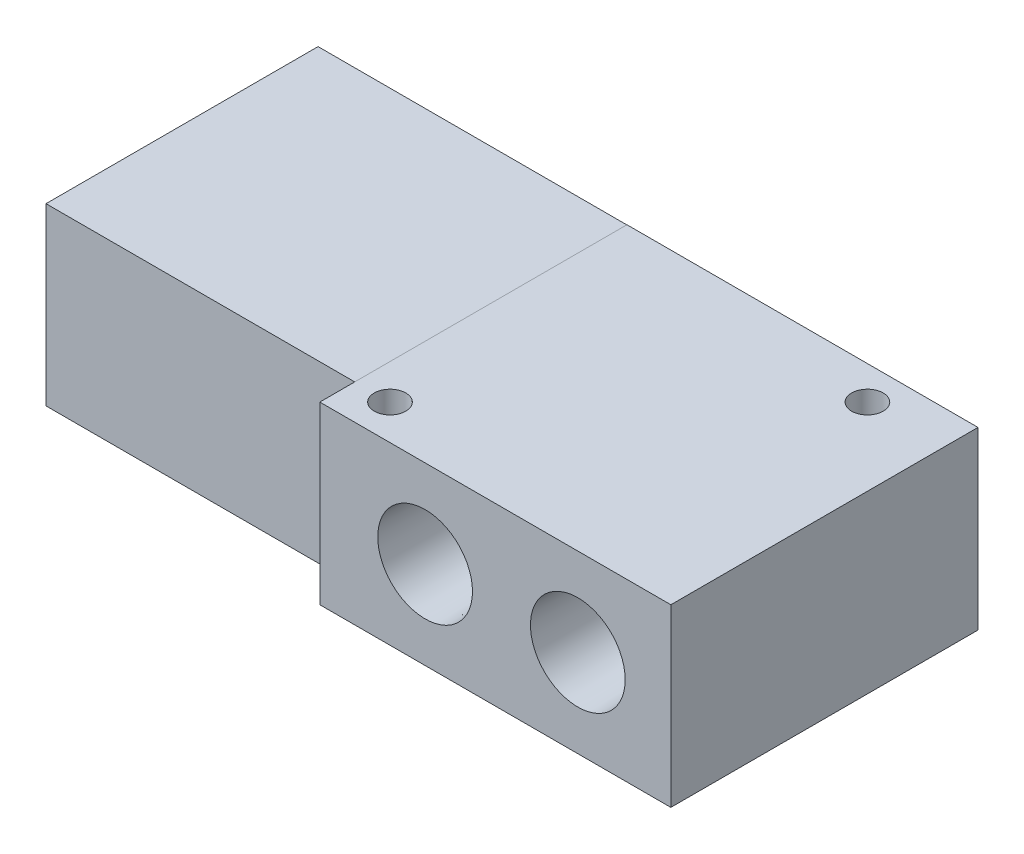
ISO-10303-21;
HEADER;
FILE_DESCRIPTION(('STEP AP214'),'2;1');
FILE_NAME('part.step','',(''),(''),'','','');
FILE_SCHEMA(('AUTOMOTIVE_DESIGN { 1 0 10303 214 1 1 1 1 }'));
ENDSEC;
DATA;
#1=APPLICATION_CONTEXT('core data for automotive mechanical design processes');
#2=APPLICATION_PROTOCOL_DEFINITION('international standard','automotive_design',2000,#1);
#3=PRODUCT_CONTEXT('',#1,'mechanical');
#4=PRODUCT('Part','Part','',(#3));
#5=PRODUCT_RELATED_PRODUCT_CATEGORY('part','',(#4));
#6=PRODUCT_DEFINITION_FORMATION('','',#4);
#7=PRODUCT_DEFINITION_CONTEXT('part definition',#1,'design');
#8=PRODUCT_DEFINITION('design','',#6,#7);
#9=PRODUCT_DEFINITION_SHAPE('','',#8);
#10=(LENGTH_UNIT() NAMED_UNIT(*) SI_UNIT(.MILLI.,.METRE.));
#11=(NAMED_UNIT(*) PLANE_ANGLE_UNIT() SI_UNIT($,.RADIAN.));
#12=(NAMED_UNIT(*) SI_UNIT($,.STERADIAN.) SOLID_ANGLE_UNIT());
#13=UNCERTAINTY_MEASURE_WITH_UNIT(LENGTH_MEASURE(1.E-05),#10,'distance_accuracy_value','');
#14=(GEOMETRIC_REPRESENTATION_CONTEXT(3) GLOBAL_UNCERTAINTY_ASSIGNED_CONTEXT((#13)) GLOBAL_UNIT_ASSIGNED_CONTEXT((#10,
#11,#12)) REPRESENTATION_CONTEXT('',''));
#15=CARTESIAN_POINT('',(0.,0.,0.));
#16=DIRECTION('',(0.,0.,1.));
#17=DIRECTION('',(1.,0.,0.));
#18=AXIS2_PLACEMENT_3D('',#15,#16,#17);
#19=CARTESIAN_POINT('',(95.504,25.4,5.08));
#20=DIRECTION('',(-1.,0.,0.));
#21=DIRECTION('',(0.,0.,1.));
#22=AXIS2_PLACEMENT_3D('',#19,#20,#21);
#23=PLANE('',#22);
#24=DIRECTION('',(0.,0.,-1.));
#25=VECTOR('',#24,1.);
#26=CARTESIAN_POINT('',(95.504,0.,5.08));
#27=LINE('',#26,#25);
#28=CARTESIAN_POINT('',(95.504,0.,5.08));
#29=VERTEX_POINT('',#28);
#30=CARTESIAN_POINT('',(95.504,0.,-39.37));
#31=VERTEX_POINT('',#30);
#32=EDGE_CURVE('E190',#29,#31,#27,.T.);
#33=ORIENTED_EDGE('',*,*,#32,.T.);
#34=DIRECTION('',(0.,-1.,0.));
#35=VECTOR('',#34,1.);
#36=CARTESIAN_POINT('',(95.504,25.4,-39.37));
#37=LINE('',#36,#35);
#38=CARTESIAN_POINT('',(95.504,25.4,-39.37));
#39=VERTEX_POINT('',#38);
#40=EDGE_CURVE('E11',#39,#31,#37,.T.);
#41=ORIENTED_EDGE('',*,*,#40,.F.);
#42=DIRECTION('',(0.,0.,-1.));
#43=VECTOR('',#42,1.);
#44=CARTESIAN_POINT('',(95.504,25.4,5.08));
#45=LINE('',#44,#43);
#46=CARTESIAN_POINT('',(95.504,25.4,5.08));
#47=VERTEX_POINT('',#46);
#48=EDGE_CURVE('E192',#47,#39,#45,.T.);
#49=ORIENTED_EDGE('',*,*,#48,.F.);
#50=DIRECTION('',(0.,-1.,0.));
#51=VECTOR('',#50,1.);
#52=CARTESIAN_POINT('',(95.504,25.4,5.08));
#53=LINE('',#52,#51);
#54=EDGE_CURVE('E198',#47,#29,#53,.T.);
#55=ORIENTED_EDGE('',*,*,#54,.T.);
#56=EDGE_LOOP('',(#33,#41,#49,#55));
#57=FACE_BOUND('',#56,.T.);
#58=ADVANCED_FACE('F33',(#57),#23,.F.);
#59=CARTESIAN_POINT('',(0.,25.4,-39.37));
#60=DIRECTION('',(0.,0.,1.));
#61=DIRECTION('',(1.,0.,0.));
#62=AXIS2_PLACEMENT_3D('',#59,#60,#61);
#63=PLANE('',#62);
#64=CARTESIAN_POINT('',(69.85,12.7,-39.37));
#65=DIRECTION('',(0.,0.,-1.));
#66=DIRECTION('',(-1.,0.,0.));
#67=AXIS2_PLACEMENT_3D('',#64,#65,#66);
#68=CIRCLE('',#67,6.8545837);
#69=CARTESIAN_POINT('',(62.9954163,12.7,-39.37));
#70=VERTEX_POINT('',#69);
#71=EDGE_CURVE('E142',#70,#70,#68,.T.);
#72=ORIENTED_EDGE('',*,*,#71,.F.);
#73=EDGE_LOOP('',(#72));
#74=FACE_BOUND('',#73,.T.);
#75=DIRECTION('',(0.,1.,0.));
#76=VECTOR('',#75,1.);
#77=CARTESIAN_POINT('',(44.704,0.,-39.37));
#78=LINE('',#77,#76);
#79=CARTESIAN_POINT('',(44.704,0.,-39.37));
#80=VERTEX_POINT('',#79);
#81=CARTESIAN_POINT('',(44.704,0.0254000000000018,-39.37));
#82=VERTEX_POINT('',#81);
#83=EDGE_CURVE('E167',#80,#82,#78,.T.);
#84=ORIENTED_EDGE('',*,*,#83,.T.);
#85=DIRECTION('',(-1.,0.,0.));
#86=VECTOR('',#85,1.);
#87=CARTESIAN_POINT('',(0.,0.0254000000000001,-39.37));
#88=LINE('',#87,#86);
#89=CARTESIAN_POINT('',(0.,0.0254000000000001,-39.37));
#90=VERTEX_POINT('',#89);
#91=EDGE_CURVE('E170',#82,#90,#88,.T.);
#92=ORIENTED_EDGE('',*,*,#91,.T.);
#93=DIRECTION('',(0.,-1.,0.));
#94=VECTOR('',#93,1.);
#95=CARTESIAN_POINT('',(0.,25.4,-39.37));
#96=LINE('',#95,#94);
#97=CARTESIAN_POINT('',(0.,25.3746,-39.37));
#98=VERTEX_POINT('',#97);
#99=EDGE_CURVE('E40',#98,#90,#96,.T.);
#100=ORIENTED_EDGE('',*,*,#99,.F.);
#101=DIRECTION('',(1.,0.,0.));
#102=VECTOR('',#101,1.);
#103=CARTESIAN_POINT('',(0.,25.3746,-39.37));
#104=LINE('',#103,#102);
#105=CARTESIAN_POINT('',(44.704,25.3746,-39.37));
#106=VERTEX_POINT('',#105);
#107=EDGE_CURVE('E180',#98,#106,#104,.T.);
#108=ORIENTED_EDGE('',*,*,#107,.T.);
#109=DIRECTION('',(0.,1.,0.));
#110=VECTOR('',#109,1.);
#111=CARTESIAN_POINT('',(44.704,25.4,-39.37));
#112=LINE('',#111,#110);
#113=CARTESIAN_POINT('',(44.704,25.4,-39.37));
#114=VERTEX_POINT('',#113);
#115=EDGE_CURVE('E183',#106,#114,#112,.T.);
#116=ORIENTED_EDGE('',*,*,#115,.T.);
#117=DIRECTION('',(-1.,0.,0.));
#118=VECTOR('',#117,1.);
#119=CARTESIAN_POINT('',(0.,25.4,-39.37));
#120=LINE('',#119,#118);
#121=EDGE_CURVE('E76',#39,#114,#120,.T.);
#122=ORIENTED_EDGE('',*,*,#121,.F.);
#123=ORIENTED_EDGE('',*,*,#40,.T.);
#124=DIRECTION('',(-1.,0.,0.));
#125=VECTOR('',#124,1.);
#126=CARTESIAN_POINT('',(0.,0.,-39.37));
#127=LINE('',#126,#125);
#128=EDGE_CURVE('E201',#31,#80,#127,.T.);
#129=ORIENTED_EDGE('',*,*,#128,.T.);
#130=EDGE_LOOP('',(#84,#92,#100,#108,#116,#122,#123,#129));
#131=FACE_BOUND('',#130,.T.);
#132=ADVANCED_FACE('F220',(#74,#131),#63,.F.);
#133=CARTESIAN_POINT('',(0.,25.4,0.));
#134=DIRECTION('',(1.,0.,0.));
#135=DIRECTION('',(0.,0.,-1.));
#136=AXIS2_PLACEMENT_3D('',#133,#134,#135);
#137=PLANE('',#136);
#138=ORIENTED_EDGE('',*,*,#99,.T.);
#139=DIRECTION('',(0.,0.,1.));
#140=VECTOR('',#139,1.);
#141=CARTESIAN_POINT('',(0.,0.0254000000000001,-39.37));
#142=LINE('',#141,#140);
#143=CARTESIAN_POINT('',(0.,0.0254000000000001,0.));
#144=VERTEX_POINT('',#143);
#145=EDGE_CURVE('E175',#90,#144,#142,.T.);
#146=ORIENTED_EDGE('',*,*,#145,.T.);
#147=DIRECTION('',(0.,-1.,0.));
#148=VECTOR('',#147,1.);
#149=CARTESIAN_POINT('',(0.,25.4,0.));
#150=LINE('',#149,#148);
#151=CARTESIAN_POINT('',(0.,25.3746,0.));
#152=VERTEX_POINT('',#151);
#153=EDGE_CURVE('E212',#152,#144,#150,.T.);
#154=ORIENTED_EDGE('',*,*,#153,.F.);
#155=DIRECTION('',(0.,0.,1.));
#156=VECTOR('',#155,1.);
#157=CARTESIAN_POINT('',(0.,25.3746,-39.37));
#158=LINE('',#157,#156);
#159=EDGE_CURVE('E185',#98,#152,#158,.T.);
#160=ORIENTED_EDGE('',*,*,#159,.F.);
#161=EDGE_LOOP('',(#138,#146,#154,#160));
#162=FACE_BOUND('',#161,.T.);
#163=ADVANCED_FACE('F218',(#162),#137,.F.);
#164=CARTESIAN_POINT('',(0.,25.4,0.));
#165=DIRECTION('',(0.,0.,-1.));
#166=DIRECTION('',(-1.,0.,0.));
#167=AXIS2_PLACEMENT_3D('',#164,#165,#166);
#168=PLANE('',#167);
#169=ORIENTED_EDGE('',*,*,#153,.T.);
#170=DIRECTION('',(-1.,0.,0.));
#171=VECTOR('',#170,1.);
#172=CARTESIAN_POINT('',(0.,0.0254000000000001,0.));
#173=LINE('',#172,#171);
#174=CARTESIAN_POINT('',(44.704,0.0254000000000018,0.));
#175=VERTEX_POINT('',#174);
#176=EDGE_CURVE('E164',#175,#144,#173,.T.);
#177=ORIENTED_EDGE('',*,*,#176,.F.);
#178=DIRECTION('',(0.,-1.,0.));
#179=VECTOR('',#178,1.);
#180=CARTESIAN_POINT('',(44.704,25.4,0.));
#181=LINE('',#180,#179);
#182=CARTESIAN_POINT('',(44.704,25.3746,0.));
#183=VERTEX_POINT('',#182);
#184=EDGE_CURVE('E209',#183,#175,#181,.T.);
#185=ORIENTED_EDGE('',*,*,#184,.F.);
#186=DIRECTION('',(1.,0.,0.));
#187=VECTOR('',#186,1.);
#188=CARTESIAN_POINT('',(0.,25.3746,0.));
#189=LINE('',#188,#187);
#190=EDGE_CURVE('E178',#152,#183,#189,.T.);
#191=ORIENTED_EDGE('',*,*,#190,.F.);
#192=EDGE_LOOP('',(#169,#177,#185,#191));
#193=FACE_BOUND('',#192,.T.);
#194=ADVANCED_FACE('F227',(#193),#168,.F.);
#195=CARTESIAN_POINT('',(44.704,25.4,5.08));
#196=DIRECTION('',(1.,0.,0.));
#197=DIRECTION('',(0.,0.,-1.));
#198=AXIS2_PLACEMENT_3D('',#195,#196,#197);
#199=PLANE('',#198);
#200=DIRECTION('',(0.,0.,1.));
#201=VECTOR('',#200,1.);
#202=CARTESIAN_POINT('',(44.704,0.,5.08));
#203=LINE('',#202,#201);
#204=CARTESIAN_POINT('',(44.704,0.,5.08));
#205=VERTEX_POINT('',#204);
#206=EDGE_CURVE('E47',#80,#205,#203,.T.);
#207=ORIENTED_EDGE('',*,*,#206,.T.);
#208=DIRECTION('',(0.,-1.,0.));
#209=VECTOR('',#208,1.);
#210=CARTESIAN_POINT('',(44.704,25.4,5.08));
#211=LINE('',#210,#209);
#212=CARTESIAN_POINT('',(44.704,25.4,5.08));
#213=VERTEX_POINT('',#212);
#214=EDGE_CURVE('E207',#213,#205,#211,.T.);
#215=ORIENTED_EDGE('',*,*,#214,.F.);
#216=DIRECTION('',(0.,0.,1.));
#217=VECTOR('',#216,1.);
#218=CARTESIAN_POINT('',(44.704,25.4,5.08));
#219=LINE('',#218,#217);
#220=EDGE_CURVE('E195',#114,#213,#219,.T.);
#221=ORIENTED_EDGE('',*,*,#220,.F.);
#222=ORIENTED_EDGE('',*,*,#115,.F.);
#223=DIRECTION('',(0.,0.,1.));
#224=VECTOR('',#223,1.);
#225=CARTESIAN_POINT('',(44.704,25.3746,-39.37));
#226=LINE('',#225,#224);
#227=EDGE_CURVE('E188',#106,#183,#226,.T.);
#228=ORIENTED_EDGE('',*,*,#227,.T.);
#229=ORIENTED_EDGE('',*,*,#184,.T.);
#230=DIRECTION('',(0.,0.,1.));
#231=VECTOR('',#230,1.);
#232=CARTESIAN_POINT('',(44.704,0.0254000000000018,-39.37));
#233=LINE('',#232,#231);
#234=EDGE_CURVE('E173',#82,#175,#233,.T.);
#235=ORIENTED_EDGE('',*,*,#234,.F.);
#236=ORIENTED_EDGE('',*,*,#83,.F.);
#237=EDGE_LOOP('',(#207,#215,#221,#222,#228,#229,#235,#236));
#238=FACE_BOUND('',#237,.T.);
#239=ADVANCED_FACE('F230',(#238),#199,.F.);
#240=CARTESIAN_POINT('',(44.704,25.4,5.08));
#241=DIRECTION('',(0.,0.,-1.));
#242=DIRECTION('',(-1.,0.,0.));
#243=AXIS2_PLACEMENT_3D('',#240,#241,#242);
#244=PLANE('',#243);
#245=CARTESIAN_POINT('',(59.944,12.7,5.08000000000001));
#246=DIRECTION('',(0.,0.,1.));
#247=DIRECTION('',(1.,0.,0.));
#248=AXIS2_PLACEMENT_3D('',#245,#246,#247);
#249=CIRCLE('',#248,6.8545837);
#250=CARTESIAN_POINT('',(66.7985837,12.7,5.08000000000001));
#251=VERTEX_POINT('',#250);
#252=EDGE_CURVE('E476',#251,#251,#249,.T.);
#253=ORIENTED_EDGE('',*,*,#252,.F.);
#254=EDGE_LOOP('',(#253));
#255=FACE_BOUND('',#254,.T.);
#256=CARTESIAN_POINT('',(82.042,12.7,5.08000000000001));
#257=DIRECTION('',(0.,0.,1.));
#258=DIRECTION('',(1.,0.,0.));
#259=AXIS2_PLACEMENT_3D('',#256,#257,#258);
#260=CIRCLE('',#259,6.8545837);
#261=CARTESIAN_POINT('',(88.8965837,12.7,5.08000000000001));
#262=VERTEX_POINT('',#261);
#263=EDGE_CURVE('E123',#262,#262,#260,.T.);
#264=ORIENTED_EDGE('',*,*,#263,.F.);
#265=EDGE_LOOP('',(#264));
#266=FACE_BOUND('',#265,.T.);
#267=DIRECTION('',(1.,0.,0.));
#268=VECTOR('',#267,1.);
#269=CARTESIAN_POINT('',(44.704,0.,5.08));
#270=LINE('',#269,#268);
#271=EDGE_CURVE('E70',#205,#29,#270,.T.);
#272=ORIENTED_EDGE('',*,*,#271,.T.);
#273=ORIENTED_EDGE('',*,*,#54,.F.);
#274=DIRECTION('',(1.,0.,0.));
#275=VECTOR('',#274,1.);
#276=CARTESIAN_POINT('',(44.704,25.4,5.08));
#277=LINE('',#276,#275);
#278=EDGE_CURVE('E56',#213,#47,#277,.T.);
#279=ORIENTED_EDGE('',*,*,#278,.F.);
#280=ORIENTED_EDGE('',*,*,#214,.T.);
#281=EDGE_LOOP('',(#272,#273,#279,#280));
#282=FACE_BOUND('',#281,.T.);
#283=ADVANCED_FACE('F256',(#255,#266,#282),#244,.F.);
#284=CARTESIAN_POINT('',(0.,25.4,0.));
#285=DIRECTION('',(0.,-1.,0.));
#286=DIRECTION('',(0.,0.,-1.));
#287=AXIS2_PLACEMENT_3D('',#284,#285,#286);
#288=PLANE('',#287);
#289=CARTESIAN_POINT('',(84.328,25.4,-34.544));
#290=DIRECTION('',(0.,1.,0.));
#291=DIRECTION('',(0.,0.,1.));
#292=AXIS2_PLACEMENT_3D('',#289,#290,#291);
#293=CIRCLE('',#292,2.28599999999999);
#294=CARTESIAN_POINT('',(84.328,25.4,-32.258));
#295=VERTEX_POINT('',#294);
#296=EDGE_CURVE('E154',#295,#295,#293,.T.);
#297=ORIENTED_EDGE('',*,*,#296,.F.);
#298=EDGE_LOOP('',(#297));
#299=FACE_BOUND('',#298,.T.);
#300=CARTESIAN_POINT('',(49.784,25.4,0.));
#301=DIRECTION('',(0.,1.,0.));
#302=DIRECTION('',(0.,0.,1.));
#303=AXIS2_PLACEMENT_3D('',#300,#301,#302);
#304=CIRCLE('',#303,2.28599999999999);
#305=CARTESIAN_POINT('',(49.784,25.4,2.286));
#306=VERTEX_POINT('',#305);
#307=EDGE_CURVE('E158',#306,#306,#304,.T.);
#308=ORIENTED_EDGE('',*,*,#307,.F.);
#309=EDGE_LOOP('',(#308));
#310=FACE_BOUND('',#309,.T.);
#311=ORIENTED_EDGE('',*,*,#121,.T.);
#312=ORIENTED_EDGE('',*,*,#220,.T.);
#313=ORIENTED_EDGE('',*,*,#278,.T.);
#314=ORIENTED_EDGE('',*,*,#48,.T.);
#315=EDGE_LOOP('',(#311,#312,#313,#314));
#316=FACE_BOUND('',#315,.T.);
#317=ADVANCED_FACE('F243',(#299,#310,#316),#288,.F.);
#318=CARTESIAN_POINT('',(0.,0.,0.));
#319=DIRECTION('',(0.,-1.,0.));
#320=DIRECTION('',(0.,0.,-1.));
#321=AXIS2_PLACEMENT_3D('',#318,#319,#320);
#322=PLANE('',#321);
#323=CARTESIAN_POINT('',(84.328,0.,-34.544));
#324=DIRECTION('',(0.,1.,0.));
#325=DIRECTION('',(0.,0.,1.));
#326=AXIS2_PLACEMENT_3D('',#323,#324,#325);
#327=CIRCLE('',#326,2.28599999999999);
#328=CARTESIAN_POINT('',(84.328,0.,-32.258));
#329=VERTEX_POINT('',#328);
#330=EDGE_CURVE('E155',#329,#329,#327,.T.);
#331=ORIENTED_EDGE('',*,*,#330,.T.);
#332=EDGE_LOOP('',(#331));
#333=FACE_BOUND('',#332,.T.);
#334=CARTESIAN_POINT('',(49.784,0.,0.));
#335=DIRECTION('',(0.,1.,0.));
#336=DIRECTION('',(0.,0.,1.));
#337=AXIS2_PLACEMENT_3D('',#334,#335,#336);
#338=CIRCLE('',#337,2.28599999999999);
#339=CARTESIAN_POINT('',(49.784,0.,2.286));
#340=VERTEX_POINT('',#339);
#341=EDGE_CURVE('E161',#340,#340,#338,.T.);
#342=ORIENTED_EDGE('',*,*,#341,.T.);
#343=EDGE_LOOP('',(#342));
#344=FACE_BOUND('',#343,.T.);
#345=ORIENTED_EDGE('',*,*,#206,.F.);
#346=ORIENTED_EDGE('',*,*,#128,.F.);
#347=ORIENTED_EDGE('',*,*,#32,.F.);
#348=ORIENTED_EDGE('',*,*,#271,.F.);
#349=EDGE_LOOP('',(#345,#346,#347,#348));
#350=FACE_BOUND('',#349,.T.);
#351=ADVANCED_FACE('F235',(#333,#344,#350),#322,.T.);
#352=CARTESIAN_POINT('',(0.,25.3746,-39.37));
#353=DIRECTION('',(0.,-1.,0.));
#354=DIRECTION('',(0.,0.,-1.));
#355=AXIS2_PLACEMENT_3D('',#352,#353,#354);
#356=PLANE('',#355);
#357=ORIENTED_EDGE('',*,*,#190,.T.);
#358=ORIENTED_EDGE('',*,*,#227,.F.);
#359=ORIENTED_EDGE('',*,*,#107,.F.);
#360=ORIENTED_EDGE('',*,*,#159,.T.);
#361=EDGE_LOOP('',(#357,#358,#359,#360));
#362=FACE_BOUND('',#361,.T.);
#363=ADVANCED_FACE('F233',(#362),#356,.F.);
#364=CARTESIAN_POINT('',(0.,0.0254000000000001,-39.37));
#365=DIRECTION('',(0.,1.,0.));
#366=DIRECTION('',(-1.,0.,0.));
#367=AXIS2_PLACEMENT_3D('',#364,#365,#366);
#368=PLANE('',#367);
#369=ORIENTED_EDGE('',*,*,#176,.T.);
#370=ORIENTED_EDGE('',*,*,#145,.F.);
#371=ORIENTED_EDGE('',*,*,#91,.F.);
#372=ORIENTED_EDGE('',*,*,#234,.T.);
#373=EDGE_LOOP('',(#369,#370,#371,#372));
#374=FACE_BOUND('',#373,.T.);
#375=ADVANCED_FACE('F223',(#374),#368,.F.);
#376=CARTESIAN_POINT('',(49.784,0.,0.));
#377=DIRECTION('',(0.,1.,0.));
#378=DIRECTION('',(0.,0.,1.));
#379=AXIS2_PLACEMENT_3D('',#376,#377,#378);
#380=CYLINDRICAL_SURFACE('',#379,2.28599999999999);
#381=ORIENTED_EDGE('',*,*,#341,.F.);
#382=EDGE_LOOP('',(#381));
#383=FACE_BOUND('',#382,.T.);
#384=ORIENTED_EDGE('',*,*,#307,.T.);
#385=EDGE_LOOP('',(#384));
#386=FACE_BOUND('',#385,.T.);
#387=ADVANCED_FACE('F241',(#383,#386),#380,.F.);
#388=CARTESIAN_POINT('',(84.328,0.,-34.544));
#389=DIRECTION('',(0.,1.,0.));
#390=DIRECTION('',(0.,0.,1.));
#391=AXIS2_PLACEMENT_3D('',#388,#389,#390);
#392=CYLINDRICAL_SURFACE('',#391,2.28599999999999);
#393=ORIENTED_EDGE('',*,*,#330,.F.);
#394=EDGE_LOOP('',(#393));
#395=FACE_BOUND('',#394,.T.);
#396=ORIENTED_EDGE('',*,*,#296,.T.);
#397=EDGE_LOOP('',(#396));
#398=FACE_BOUND('',#397,.T.);
#399=ADVANCED_FACE('F305',(#395,#398),#392,.F.);
#400=CARTESIAN_POINT('',(69.85,12.7,-22.352));
#401=DIRECTION('',(0.,0.,-1.));
#402=DIRECTION('',(-1.,0.,0.));
#403=AXIS2_PLACEMENT_3D('',#400,#401,#402);
#404=CONICAL_SURFACE('',#403,5.56260000000001,1.02974425867665);
#405=CARTESIAN_POINT('',(69.85,12.7,-19.0096527205973));
#406=VERTEX_POINT('',#405);
#407=VERTEX_LOOP('',#406);
#408=FACE_BOUND('',#407,.T.);
#409=CARTESIAN_POINT('',(69.85,12.7,-22.352));
#410=DIRECTION('',(0.,0.,-1.));
#411=DIRECTION('',(-1.,0.,0.));
#412=AXIS2_PLACEMENT_3D('',#409,#410,#411);
#413=CIRCLE('',#412,5.56260000000001);
#414=CARTESIAN_POINT('',(64.2874,12.7,-22.352));
#415=VERTEX_POINT('',#414);
#416=EDGE_CURVE('E151',#415,#415,#413,.T.);
#417=ORIENTED_EDGE('',*,*,#416,.T.);
#418=EDGE_LOOP('',(#417));
#419=FACE_BOUND('',#418,.T.);
#420=ADVANCED_FACE('F299',(#408,#419),#404,.F.);
#421=CARTESIAN_POINT('',(69.85,12.7,-39.37));
#422=DIRECTION('',(0.,0.,-1.));
#423=DIRECTION('',(-1.,0.,0.));
#424=AXIS2_PLACEMENT_3D('',#421,#422,#423);
#425=CYLINDRICAL_SURFACE('',#424,5.56260000000001);
#426=ORIENTED_EDGE('',*,*,#416,.F.);
#427=EDGE_LOOP('',(#426));
#428=FACE_BOUND('',#427,.T.);
#429=CARTESIAN_POINT('',(69.85,12.7,-29.464));
#430=DIRECTION('',(0.,0.,-1.));
#431=DIRECTION('',(-1.,0.,0.));
#432=AXIS2_PLACEMENT_3D('',#429,#430,#431);
#433=CIRCLE('',#432,5.5626);
#434=CARTESIAN_POINT('',(64.2874,12.7,-29.464));
#435=VERTEX_POINT('',#434);
#436=EDGE_CURVE('E148',#435,#435,#433,.T.);
#437=ORIENTED_EDGE('',*,*,#436,.T.);
#438=EDGE_LOOP('',(#437));
#439=FACE_BOUND('',#438,.T.);
#440=ADVANCED_FACE('F304',(#428,#439),#425,.F.);
#441=CARTESIAN_POINT('',(75.4126,12.7,-29.464));
#442=DIRECTION('',(0.,0.,1.));
#443=DIRECTION('',(1.,0.,0.));
#444=AXIS2_PLACEMENT_3D('',#441,#442,#443);
#445=PLANE('',#444);
#446=ORIENTED_EDGE('',*,*,#436,.F.);
#447=EDGE_LOOP('',(#446));
#448=FACE_BOUND('',#447,.T.);
#449=CARTESIAN_POINT('',(69.85,12.7,-29.464));
#450=DIRECTION('',(0.,0.,-1.));
#451=DIRECTION('',(-1.,0.,0.));
#452=AXIS2_PLACEMENT_3D('',#449,#450,#451);
#453=CIRCLE('',#452,6.55798479417671);
#454=CARTESIAN_POINT('',(63.2920152058233,12.7,-29.464));
#455=VERTEX_POINT('',#454);
#456=EDGE_CURVE('E145',#455,#455,#453,.T.);
#457=ORIENTED_EDGE('',*,*,#456,.T.);
#458=EDGE_LOOP('',(#457));
#459=FACE_BOUND('',#458,.T.);
#460=ADVANCED_FACE('F317',(#448,#459),#445,.F.);
#461=CARTESIAN_POINT('',(69.85,12.7,-39.37));
#462=DIRECTION('',(0.,0.,-1.));
#463=DIRECTION('',(-1.,0.,0.));
#464=AXIS2_PLACEMENT_3D('',#461,#462,#463);
#465=CONICAL_SURFACE('',#464,6.8545837,0.0299323966717032);
#466=ORIENTED_EDGE('',*,*,#456,.F.);
#467=EDGE_LOOP('',(#466));
#468=FACE_BOUND('',#467,.T.);
#469=ORIENTED_EDGE('',*,*,#71,.T.);
#470=EDGE_LOOP('',(#469));
#471=FACE_BOUND('',#470,.T.);
#472=ADVANCED_FACE('F327',(#468,#471),#465,.F.);
#473=CARTESIAN_POINT('',(82.042,12.7,-11.938));
#474=DIRECTION('',(0.,0.,1.));
#475=DIRECTION('',(1.,0.,0.));
#476=AXIS2_PLACEMENT_3D('',#473,#474,#475);
#477=CONICAL_SURFACE('',#476,5.56260000000001,1.02974425867665);
#478=CARTESIAN_POINT('',(82.042,12.7,-15.2803472794027));
#479=VERTEX_POINT('',#478);
#480=VERTEX_LOOP('',#479);
#481=FACE_BOUND('',#480,.T.);
#482=CARTESIAN_POINT('',(82.042,12.7,-11.938));
#483=DIRECTION('',(0.,0.,1.));
#484=DIRECTION('',(1.,0.,0.));
#485=AXIS2_PLACEMENT_3D('',#482,#483,#484);
#486=CIRCLE('',#485,5.56260000000001);
#487=CARTESIAN_POINT('',(87.6046,12.7,-11.938));
#488=VERTEX_POINT('',#487);
#489=EDGE_CURVE('E139',#488,#488,#486,.T.);
#490=ORIENTED_EDGE('',*,*,#489,.T.);
#491=EDGE_LOOP('',(#490));
#492=FACE_BOUND('',#491,.T.);
#493=ADVANCED_FACE('F337',(#481,#492),#477,.F.);
#494=CARTESIAN_POINT('',(82.042,12.7,5.08));
#495=DIRECTION('',(0.,0.,1.));
#496=DIRECTION('',(1.,0.,0.));
#497=AXIS2_PLACEMENT_3D('',#494,#495,#496);
#498=CYLINDRICAL_SURFACE('',#497,5.56260000000001);
#499=ORIENTED_EDGE('',*,*,#489,.F.);
#500=EDGE_LOOP('',(#499));
#501=FACE_BOUND('',#500,.T.);
#502=CARTESIAN_POINT('',(82.042,12.7,-4.826));
#503=DIRECTION('',(0.,0.,1.));
#504=DIRECTION('',(1.,0.,0.));
#505=AXIS2_PLACEMENT_3D('',#502,#503,#504);
#506=CIRCLE('',#505,5.5626);
#507=CARTESIAN_POINT('',(87.6046,12.7,-4.826));
#508=VERTEX_POINT('',#507);
#509=EDGE_CURVE('E136',#508,#508,#506,.T.);
#510=ORIENTED_EDGE('',*,*,#509,.T.);
#511=EDGE_LOOP('',(#510));
#512=FACE_BOUND('',#511,.T.);
#513=ADVANCED_FACE('F347',(#501,#512),#498,.F.);
#514=CARTESIAN_POINT('',(87.6046,12.7,-4.826));
#515=DIRECTION('',(0.,0.,-1.));
#516=DIRECTION('',(-1.,0.,0.));
#517=AXIS2_PLACEMENT_3D('',#514,#515,#516);
#518=PLANE('',#517);
#519=ORIENTED_EDGE('',*,*,#509,.F.);
#520=EDGE_LOOP('',(#519));
#521=FACE_BOUND('',#520,.T.);
#522=CARTESIAN_POINT('',(82.042,12.7,-4.826));
#523=DIRECTION('',(0.,0.,1.));
#524=DIRECTION('',(1.,0.,0.));
#525=AXIS2_PLACEMENT_3D('',#522,#523,#524);
#526=CIRCLE('',#525,6.55798479417671);
#527=CARTESIAN_POINT('',(88.5999847941767,12.7,-4.826));
#528=VERTEX_POINT('',#527);
#529=EDGE_CURVE('E127',#528,#528,#526,.T.);
#530=ORIENTED_EDGE('',*,*,#529,.T.);
#531=EDGE_LOOP('',(#530));
#532=FACE_BOUND('',#531,.T.);
#533=ADVANCED_FACE('F357',(#521,#532),#518,.F.);
#534=CARTESIAN_POINT('',(82.042,12.7,5.08000000000001));
#535=DIRECTION('',(0.,0.,1.));
#536=DIRECTION('',(1.,0.,0.));
#537=AXIS2_PLACEMENT_3D('',#534,#535,#536);
#538=CONICAL_SURFACE('',#537,6.8545837,0.0299323966717032);
#539=ORIENTED_EDGE('',*,*,#529,.F.);
#540=EDGE_LOOP('',(#539));
#541=FACE_BOUND('',#540,.T.);
#542=ORIENTED_EDGE('',*,*,#263,.T.);
#543=EDGE_LOOP('',(#542));
#544=FACE_BOUND('',#543,.T.);
#545=ADVANCED_FACE('F117',(#541,#544),#538,.F.);
#546=CARTESIAN_POINT('',(59.944,12.7,-11.938));
#547=DIRECTION('',(0.,0.,1.));
#548=DIRECTION('',(1.,0.,0.));
#549=AXIS2_PLACEMENT_3D('',#546,#547,#548);
#550=CONICAL_SURFACE('',#549,5.56260000000001,1.02974425867665);
#551=CARTESIAN_POINT('',(59.944,12.7,-15.2803472794027));
#552=VERTEX_POINT('',#551);
#553=VERTEX_LOOP('',#552);
#554=FACE_BOUND('',#553,.T.);
#555=CARTESIAN_POINT('',(59.944,12.7,-11.938));
#556=DIRECTION('',(0.,0.,1.));
#557=DIRECTION('',(1.,0.,0.));
#558=AXIS2_PLACEMENT_3D('',#555,#556,#557);
#559=CIRCLE('',#558,5.56260000000001);
#560=CARTESIAN_POINT('',(65.5066,12.7,-11.938));
#561=VERTEX_POINT('',#560);
#562=EDGE_CURVE('E121',#561,#561,#559,.T.);
#563=ORIENTED_EDGE('',*,*,#562,.T.);
#564=EDGE_LOOP('',(#563));
#565=FACE_BOUND('',#564,.T.);
#566=ADVANCED_FACE('F113',(#554,#565),#550,.F.);
#567=CARTESIAN_POINT('',(59.944,12.7,5.08));
#568=DIRECTION('',(0.,0.,1.));
#569=DIRECTION('',(1.,0.,0.));
#570=AXIS2_PLACEMENT_3D('',#567,#568,#569);
#571=CYLINDRICAL_SURFACE('',#570,5.56260000000001);
#572=ORIENTED_EDGE('',*,*,#562,.F.);
#573=EDGE_LOOP('',(#572));
#574=FACE_BOUND('',#573,.T.);
#575=CARTESIAN_POINT('',(59.944,12.7,-4.826));
#576=DIRECTION('',(0.,0.,1.));
#577=DIRECTION('',(1.,0.,0.));
#578=AXIS2_PLACEMENT_3D('',#575,#576,#577);
#579=CIRCLE('',#578,5.5626);
#580=CARTESIAN_POINT('',(65.5066,12.7,-4.826));
#581=VERTEX_POINT('',#580);
#582=EDGE_CURVE('E124',#581,#581,#579,.T.);
#583=ORIENTED_EDGE('',*,*,#582,.T.);
#584=EDGE_LOOP('',(#583));
#585=FACE_BOUND('',#584,.T.);
#586=ADVANCED_FACE('F116',(#574,#585),#571,.F.);
#587=CARTESIAN_POINT('',(65.5066,12.7,-4.826));
#588=DIRECTION('',(0.,0.,-1.));
#589=DIRECTION('',(-1.,0.,0.));
#590=AXIS2_PLACEMENT_3D('',#587,#588,#589);
#591=PLANE('',#590);
#592=ORIENTED_EDGE('',*,*,#582,.F.);
#593=EDGE_LOOP('',(#592));
#594=FACE_BOUND('',#593,.T.);
#595=CARTESIAN_POINT('',(59.944,12.7,-4.826));
#596=DIRECTION('',(0.,0.,1.));
#597=DIRECTION('',(1.,0.,0.));
#598=AXIS2_PLACEMENT_3D('',#595,#596,#597);
#599=CIRCLE('',#598,6.55798479417671);
#600=CARTESIAN_POINT('',(66.5019847941767,12.7,-4.826));
#601=VERTEX_POINT('',#600);
#602=EDGE_CURVE('E130',#601,#601,#599,.T.);
#603=ORIENTED_EDGE('',*,*,#602,.T.);
#604=EDGE_LOOP('',(#603));
#605=FACE_BOUND('',#604,.T.);
#606=ADVANCED_FACE('F391',(#594,#605),#591,.F.);
#607=CARTESIAN_POINT('',(59.944,12.7,5.08000000000001));
#608=DIRECTION('',(0.,0.,1.));
#609=DIRECTION('',(1.,0.,0.));
#610=AXIS2_PLACEMENT_3D('',#607,#608,#609);
#611=CONICAL_SURFACE('',#610,6.8545837,0.0299323966717032);
#612=ORIENTED_EDGE('',*,*,#602,.F.);
#613=EDGE_LOOP('',(#612));
#614=FACE_BOUND('',#613,.T.);
#615=ORIENTED_EDGE('',*,*,#252,.T.);
#616=EDGE_LOOP('',(#615));
#617=FACE_BOUND('',#616,.T.);
#618=ADVANCED_FACE('F400',(#614,#617),#611,.F.);
#619=CLOSED_SHELL('',(#58,#132,#163,#194,#239,#283,#317,#351,#363,#375,#387,#399,#420,#440,#460,
#472,#493,#513,#533,#545,#566,#586,#606,#618));
#620=MANIFOLD_SOLID_BREP('B2',#619);
#621=ADVANCED_BREP_SHAPE_REPRESENTATION('',(#18,#620),#14);
#622=SHAPE_DEFINITION_REPRESENTATION(#9,#621);
ENDSEC;
END-ISO-10303-21;
